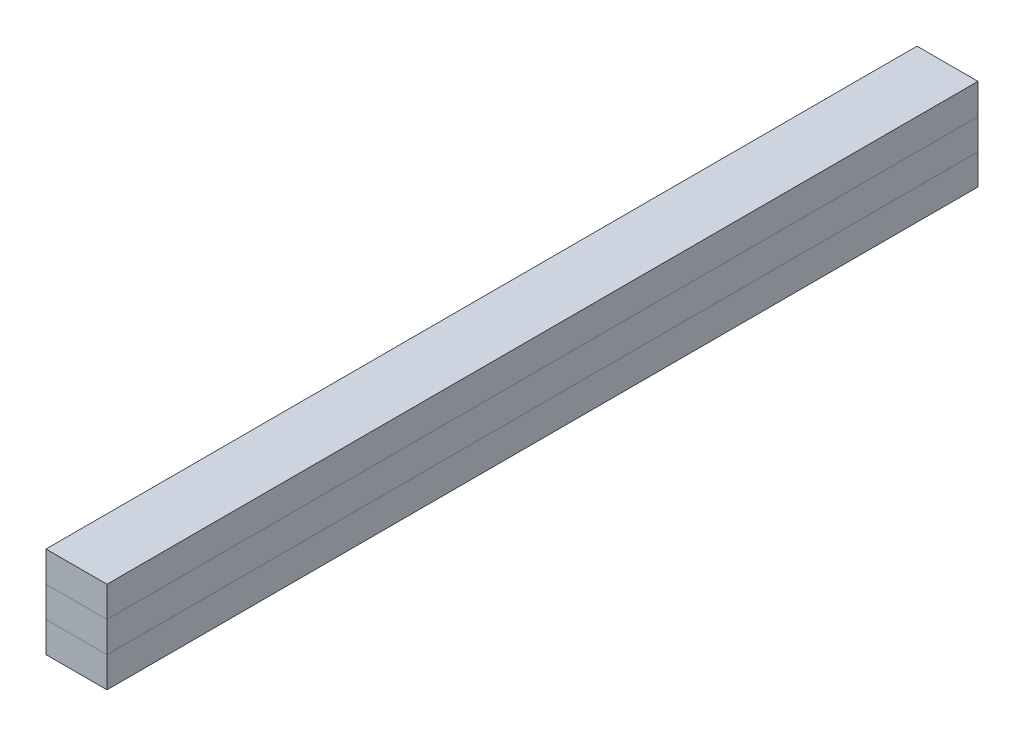
ISO-10303-21;
HEADER;
FILE_DESCRIPTION(('STEP AP214'),'2;1');
FILE_NAME('part.step','',(''),(''),'','','');
FILE_SCHEMA(('AUTOMOTIVE_DESIGN { 1 0 10303 214 1 1 1 1 }'));
ENDSEC;
DATA;
#1=APPLICATION_CONTEXT('core data for automotive mechanical design processes');
#2=APPLICATION_PROTOCOL_DEFINITION('international standard','automotive_design',2000,#1);
#3=PRODUCT_CONTEXT('',#1,'mechanical');
#4=PRODUCT('Part','Part','',(#3));
#5=PRODUCT_RELATED_PRODUCT_CATEGORY('part','',(#4));
#6=PRODUCT_DEFINITION_FORMATION('','',#4);
#7=PRODUCT_DEFINITION_CONTEXT('part definition',#1,'design');
#8=PRODUCT_DEFINITION('design','',#6,#7);
#9=PRODUCT_DEFINITION_SHAPE('','',#8);
#10=(LENGTH_UNIT() NAMED_UNIT(*) SI_UNIT(.MILLI.,.METRE.));
#11=(NAMED_UNIT(*) PLANE_ANGLE_UNIT() SI_UNIT($,.RADIAN.));
#12=(NAMED_UNIT(*) SI_UNIT($,.STERADIAN.) SOLID_ANGLE_UNIT());
#13=UNCERTAINTY_MEASURE_WITH_UNIT(LENGTH_MEASURE(1.E-05),#10,'distance_accuracy_value','');
#14=(GEOMETRIC_REPRESENTATION_CONTEXT(3) GLOBAL_UNCERTAINTY_ASSIGNED_CONTEXT((#13)) GLOBAL_UNIT_ASSIGNED_CONTEXT((#10,
#11,#12)) REPRESENTATION_CONTEXT('',''));
#15=CARTESIAN_POINT('',(0.,0.,0.));
#16=DIRECTION('',(0.,0.,1.));
#17=DIRECTION('',(1.,0.,0.));
#18=AXIS2_PLACEMENT_3D('',#15,#16,#17);
#19=CARTESIAN_POINT('',(0.,14.,-0.01));
#20=DIRECTION('',(0.,-1.,0.));
#21=DIRECTION('',(0.,0.,-1.));
#22=AXIS2_PLACEMENT_3D('',#19,#20,#21);
#23=PLANE('',#22);
#24=DIRECTION('',(0.,0.,1.));
#25=VECTOR('',#24,1.);
#26=CARTESIAN_POINT('',(0.,14.,-0.01));
#27=LINE('',#26,#25);
#28=CARTESIAN_POINT('',(0.,14.,0.));
#29=VERTEX_POINT('',#28);
#30=CARTESIAN_POINT('',(0.,14.,200.));
#31=VERTEX_POINT('',#30);
#32=EDGE_CURVE('E94',#29,#31,#27,.T.);
#33=ORIENTED_EDGE('',*,*,#32,.F.);
#34=DIRECTION('',(1.,0.,0.));
#35=VECTOR('',#34,1.);
#36=CARTESIAN_POINT('',(0.,14.,0.));
#37=LINE('',#36,#35);
#38=CARTESIAN_POINT('',(14.,14.,0.));
#39=VERTEX_POINT('',#38);
#40=EDGE_CURVE('E104',#29,#39,#37,.T.);
#41=ORIENTED_EDGE('',*,*,#40,.T.);
#42=DIRECTION('',(0.,0.,-1.));
#43=VECTOR('',#42,1.);
#44=CARTESIAN_POINT('',(14.,14.,-0.01));
#45=LINE('',#44,#43);
#46=CARTESIAN_POINT('',(14.,14.,200.));
#47=VERTEX_POINT('',#46);
#48=EDGE_CURVE('E105',#47,#39,#45,.T.);
#49=ORIENTED_EDGE('',*,*,#48,.F.);
#50=DIRECTION('',(1.,0.,0.));
#51=VECTOR('',#50,1.);
#52=CARTESIAN_POINT('',(0.,14.,200.));
#53=LINE('',#52,#51);
#54=EDGE_CURVE('E83',#31,#47,#53,.T.);
#55=ORIENTED_EDGE('',*,*,#54,.F.);
#56=EDGE_LOOP('',(#33,#41,#49,#55));
#57=FACE_BOUND('',#56,.T.);
#58=ADVANCED_FACE('F48',(#57),#23,.T.);
#59=CARTESIAN_POINT('',(0.,0.,200.));
#60=DIRECTION('',(-1.,0.,0.));
#61=DIRECTION('',(0.,0.,1.));
#62=AXIS2_PLACEMENT_3D('',#59,#60,#61);
#63=PLANE('',#62);
#64=DIRECTION('',(0.,1.,0.));
#65=VECTOR('',#64,1.);
#66=CARTESIAN_POINT('',(0.,0.,0.));
#67=LINE('',#66,#65);
#68=CARTESIAN_POINT('',(0.,21.,0.));
#69=VERTEX_POINT('',#68);
#70=EDGE_CURVE('E91',#29,#69,#67,.T.);
#71=ORIENTED_EDGE('',*,*,#70,.F.);
#72=ORIENTED_EDGE('',*,*,#32,.T.);
#73=DIRECTION('',(0.,1.,0.));
#74=VECTOR('',#73,1.);
#75=CARTESIAN_POINT('',(0.,0.,200.));
#76=LINE('',#75,#74);
#77=CARTESIAN_POINT('',(0.,21.,200.));
#78=VERTEX_POINT('',#77);
#79=EDGE_CURVE('E52',#31,#78,#76,.T.);
#80=ORIENTED_EDGE('',*,*,#79,.T.);
#81=DIRECTION('',(0.,0.,-1.));
#82=VECTOR('',#81,1.);
#83=CARTESIAN_POINT('',(0.,21.,200.));
#84=LINE('',#83,#82);
#85=EDGE_CURVE('E95',#78,#69,#84,.T.);
#86=ORIENTED_EDGE('',*,*,#85,.T.);
#87=EDGE_LOOP('',(#71,#72,#80,#86));
#88=FACE_BOUND('',#87,.T.);
#89=ADVANCED_FACE('F93',(#88),#63,.T.);
#90=CARTESIAN_POINT('',(0.,0.,0.));
#91=DIRECTION('',(0.,0.,1.));
#92=DIRECTION('',(1.,0.,0.));
#93=AXIS2_PLACEMENT_3D('',#90,#91,#92);
#94=PLANE('',#93);
#95=ORIENTED_EDGE('',*,*,#40,.F.);
#96=ORIENTED_EDGE('',*,*,#70,.T.);
#97=DIRECTION('',(1.,0.,0.));
#98=VECTOR('',#97,1.);
#99=CARTESIAN_POINT('',(0.,21.,0.));
#100=LINE('',#99,#98);
#101=CARTESIAN_POINT('',(14.,21.,0.));
#102=VERTEX_POINT('',#101);
#103=EDGE_CURVE('E58',#69,#102,#100,.T.);
#104=ORIENTED_EDGE('',*,*,#103,.T.);
#105=DIRECTION('',(0.,1.,0.));
#106=VECTOR('',#105,1.);
#107=CARTESIAN_POINT('',(14.,0.,0.));
#108=LINE('',#107,#106);
#109=EDGE_CURVE('E12',#39,#102,#108,.T.);
#110=ORIENTED_EDGE('',*,*,#109,.F.);
#111=EDGE_LOOP('',(#95,#96,#104,#110));
#112=FACE_BOUND('',#111,.T.);
#113=ADVANCED_FACE('F107',(#112),#94,.F.);
#114=CARTESIAN_POINT('',(14.,0.,200.));
#115=DIRECTION('',(-1.,0.,0.));
#116=DIRECTION('',(0.,0.,1.));
#117=AXIS2_PLACEMENT_3D('',#114,#115,#116);
#118=PLANE('',#117);
#119=DIRECTION('',(0.,1.,0.));
#120=VECTOR('',#119,1.);
#121=CARTESIAN_POINT('',(14.,0.,200.));
#122=LINE('',#121,#120);
#123=CARTESIAN_POINT('',(14.,21.,200.));
#124=VERTEX_POINT('',#123);
#125=EDGE_CURVE('E100',#47,#124,#122,.T.);
#126=ORIENTED_EDGE('',*,*,#125,.F.);
#127=ORIENTED_EDGE('',*,*,#48,.T.);
#128=ORIENTED_EDGE('',*,*,#109,.T.);
#129=DIRECTION('',(0.,0.,-1.));
#130=VECTOR('',#129,1.);
#131=CARTESIAN_POINT('',(14.,21.,200.));
#132=LINE('',#131,#130);
#133=EDGE_CURVE('E119',#124,#102,#132,.T.);
#134=ORIENTED_EDGE('',*,*,#133,.F.);
#135=EDGE_LOOP('',(#126,#127,#128,#134));
#136=FACE_BOUND('',#135,.T.);
#137=ADVANCED_FACE('F122',(#136),#118,.F.);
#138=CARTESIAN_POINT('',(0.,21.,200.));
#139=DIRECTION('',(0.,1.,0.));
#140=DIRECTION('',(0.,0.,1.));
#141=AXIS2_PLACEMENT_3D('',#138,#139,#140);
#142=PLANE('',#141);
#143=ORIENTED_EDGE('',*,*,#103,.F.);
#144=ORIENTED_EDGE('',*,*,#85,.F.);
#145=DIRECTION('',(1.,0.,0.));
#146=VECTOR('',#145,1.);
#147=CARTESIAN_POINT('',(0.,21.,200.));
#148=LINE('',#147,#146);
#149=EDGE_CURVE('E110',#78,#124,#148,.T.);
#150=ORIENTED_EDGE('',*,*,#149,.T.);
#151=ORIENTED_EDGE('',*,*,#133,.T.);
#152=EDGE_LOOP('',(#143,#144,#150,#151));
#153=FACE_BOUND('',#152,.T.);
#154=ADVANCED_FACE('F121',(#153),#142,.T.);
#155=CARTESIAN_POINT('',(0.,0.,200.));
#156=DIRECTION('',(0.,0.,1.));
#157=DIRECTION('',(1.,0.,0.));
#158=AXIS2_PLACEMENT_3D('',#155,#156,#157);
#159=PLANE('',#158);
#160=ORIENTED_EDGE('',*,*,#79,.F.);
#161=ORIENTED_EDGE('',*,*,#54,.T.);
#162=ORIENTED_EDGE('',*,*,#125,.T.);
#163=ORIENTED_EDGE('',*,*,#149,.F.);
#164=EDGE_LOOP('',(#160,#161,#162,#163));
#165=FACE_BOUND('',#164,.T.);
#166=ADVANCED_FACE('F50',(#165),#159,.T.);
#167=CLOSED_SHELL('',(#58,#89,#113,#137,#154,#166));
#168=MANIFOLD_SOLID_BREP('B2',#167);
#169=CARTESIAN_POINT('',(0.,7.,-0.01));
#170=DIRECTION('',(0.,-1.,0.));
#171=DIRECTION('',(0.,0.,-1.));
#172=AXIS2_PLACEMENT_3D('',#169,#170,#171);
#173=PLANE('',#172);
#174=DIRECTION('',(0.,0.,1.));
#175=VECTOR('',#174,1.);
#176=CARTESIAN_POINT('',(0.,7.,-0.01));
#177=LINE('',#176,#175);
#178=CARTESIAN_POINT('',(0.,7.,0.));
#179=VERTEX_POINT('',#178);
#180=CARTESIAN_POINT('',(0.,7.,200.));
#181=VERTEX_POINT('',#180);
#182=EDGE_CURVE('E242',#179,#181,#177,.T.);
#183=ORIENTED_EDGE('',*,*,#182,.T.);
#184=DIRECTION('',(1.,0.,0.));
#185=VECTOR('',#184,1.);
#186=CARTESIAN_POINT('',(0.,7.,200.));
#187=LINE('',#186,#185);
#188=CARTESIAN_POINT('',(14.,7.,200.));
#189=VERTEX_POINT('',#188);
#190=EDGE_CURVE('E244',#181,#189,#187,.T.);
#191=ORIENTED_EDGE('',*,*,#190,.T.);
#192=DIRECTION('',(0.,0.,-1.));
#193=VECTOR('',#192,1.);
#194=CARTESIAN_POINT('',(14.,7.,-0.01));
#195=LINE('',#194,#193);
#196=CARTESIAN_POINT('',(14.,7.,0.));
#197=VERTEX_POINT('',#196);
#198=EDGE_CURVE('E237',#189,#197,#195,.T.);
#199=ORIENTED_EDGE('',*,*,#198,.T.);
#200=DIRECTION('',(1.,0.,0.));
#201=VECTOR('',#200,1.);
#202=CARTESIAN_POINT('',(0.,7.,0.));
#203=LINE('',#202,#201);
#204=EDGE_CURVE('E227',#179,#197,#203,.T.);
#205=ORIENTED_EDGE('',*,*,#204,.F.);
#206=EDGE_LOOP('',(#183,#191,#199,#205));
#207=FACE_BOUND('',#206,.T.);
#208=ADVANCED_FACE('F191',(#207),#173,.F.);
#209=CARTESIAN_POINT('',(0.,0.,0.));
#210=DIRECTION('',(0.,0.,1.));
#211=DIRECTION('',(1.,0.,0.));
#212=AXIS2_PLACEMENT_3D('',#209,#210,#211);
#213=PLANE('',#212);
#214=DIRECTION('',(0.,1.,0.));
#215=VECTOR('',#214,1.);
#216=CARTESIAN_POINT('',(0.,0.,0.));
#217=LINE('',#216,#215);
#218=CARTESIAN_POINT('',(0.,0.,0.));
#219=VERTEX_POINT('',#218);
#220=EDGE_CURVE('E253',#219,#179,#217,.T.);
#221=ORIENTED_EDGE('',*,*,#220,.T.);
#222=ORIENTED_EDGE('',*,*,#204,.T.);
#223=DIRECTION('',(0.,1.,0.));
#224=VECTOR('',#223,1.);
#225=CARTESIAN_POINT('',(14.,0.,0.));
#226=LINE('',#225,#224);
#227=CARTESIAN_POINT('',(14.,0.,0.));
#228=VERTEX_POINT('',#227);
#229=EDGE_CURVE('E195',#228,#197,#226,.T.);
#230=ORIENTED_EDGE('',*,*,#229,.F.);
#231=DIRECTION('',(1.,0.,0.));
#232=VECTOR('',#231,1.);
#233=CARTESIAN_POINT('',(0.,0.,0.));
#234=LINE('',#233,#232);
#235=EDGE_CURVE('E46',#219,#228,#234,.T.);
#236=ORIENTED_EDGE('',*,*,#235,.F.);
#237=EDGE_LOOP('',(#221,#222,#230,#236));
#238=FACE_BOUND('',#237,.T.);
#239=ADVANCED_FACE('F257',(#238),#213,.F.);
#240=CARTESIAN_POINT('',(0.,0.,200.));
#241=DIRECTION('',(-1.,0.,0.));
#242=DIRECTION('',(0.,0.,1.));
#243=AXIS2_PLACEMENT_3D('',#240,#241,#242);
#244=PLANE('',#243);
#245=ORIENTED_EDGE('',*,*,#182,.F.);
#246=ORIENTED_EDGE('',*,*,#220,.F.);
#247=DIRECTION('',(0.,0.,-1.));
#248=VECTOR('',#247,1.);
#249=CARTESIAN_POINT('',(0.,0.,200.));
#250=LINE('',#249,#248);
#251=CARTESIAN_POINT('',(0.,0.,200.));
#252=VERTEX_POINT('',#251);
#253=EDGE_CURVE('E219',#252,#219,#250,.T.);
#254=ORIENTED_EDGE('',*,*,#253,.F.);
#255=DIRECTION('',(0.,1.,0.));
#256=VECTOR('',#255,1.);
#257=CARTESIAN_POINT('',(0.,0.,200.));
#258=LINE('',#257,#256);
#259=EDGE_CURVE('E251',#252,#181,#258,.T.);
#260=ORIENTED_EDGE('',*,*,#259,.T.);
#261=EDGE_LOOP('',(#245,#246,#254,#260));
#262=FACE_BOUND('',#261,.T.);
#263=ADVANCED_FACE('F258',(#262),#244,.T.);
#264=CARTESIAN_POINT('',(14.,0.,200.));
#265=DIRECTION('',(-1.,0.,0.));
#266=DIRECTION('',(0.,0.,1.));
#267=AXIS2_PLACEMENT_3D('',#264,#265,#266);
#268=PLANE('',#267);
#269=ORIENTED_EDGE('',*,*,#198,.F.);
#270=DIRECTION('',(0.,1.,0.));
#271=VECTOR('',#270,1.);
#272=CARTESIAN_POINT('',(14.,0.,200.));
#273=LINE('',#272,#271);
#274=CARTESIAN_POINT('',(14.,0.,200.));
#275=VERTEX_POINT('',#274);
#276=EDGE_CURVE('E240',#275,#189,#273,.T.);
#277=ORIENTED_EDGE('',*,*,#276,.F.);
#278=DIRECTION('',(0.,0.,-1.));
#279=VECTOR('',#278,1.);
#280=CARTESIAN_POINT('',(14.,0.,200.));
#281=LINE('',#280,#279);
#282=EDGE_CURVE('E261',#275,#228,#281,.T.);
#283=ORIENTED_EDGE('',*,*,#282,.T.);
#284=ORIENTED_EDGE('',*,*,#229,.T.);
#285=EDGE_LOOP('',(#269,#277,#283,#284));
#286=FACE_BOUND('',#285,.T.);
#287=ADVANCED_FACE('F193',(#286),#268,.F.);
#288=CARTESIAN_POINT('',(0.,0.,200.));
#289=DIRECTION('',(0.,1.,0.));
#290=DIRECTION('',(0.,0.,1.));
#291=AXIS2_PLACEMENT_3D('',#288,#289,#290);
#292=PLANE('',#291);
#293=ORIENTED_EDGE('',*,*,#235,.T.);
#294=ORIENTED_EDGE('',*,*,#282,.F.);
#295=DIRECTION('',(1.,0.,0.));
#296=VECTOR('',#295,1.);
#297=CARTESIAN_POINT('',(0.,0.,200.));
#298=LINE('',#297,#296);
#299=EDGE_CURVE('E249',#252,#275,#298,.T.);
#300=ORIENTED_EDGE('',*,*,#299,.F.);
#301=ORIENTED_EDGE('',*,*,#253,.T.);
#302=EDGE_LOOP('',(#293,#294,#300,#301));
#303=FACE_BOUND('',#302,.T.);
#304=ADVANCED_FACE('F265',(#303),#292,.F.);
#305=CARTESIAN_POINT('',(0.,0.,200.));
#306=DIRECTION('',(0.,0.,1.));
#307=DIRECTION('',(1.,0.,0.));
#308=AXIS2_PLACEMENT_3D('',#305,#306,#307);
#309=PLANE('',#308);
#310=ORIENTED_EDGE('',*,*,#190,.F.);
#311=ORIENTED_EDGE('',*,*,#259,.F.);
#312=ORIENTED_EDGE('',*,*,#299,.T.);
#313=ORIENTED_EDGE('',*,*,#276,.T.);
#314=EDGE_LOOP('',(#310,#311,#312,#313));
#315=FACE_BOUND('',#314,.T.);
#316=ADVANCED_FACE('F248',(#315),#309,.T.);
#317=CLOSED_SHELL('',(#208,#239,#263,#287,#304,#316));
#318=MANIFOLD_SOLID_BREP('B6',#317);
#319=CARTESIAN_POINT('',(0.,14.,-0.01));
#320=DIRECTION('',(0.,-1.,0.));
#321=DIRECTION('',(0.,0.,-1.));
#322=AXIS2_PLACEMENT_3D('',#319,#320,#321);
#323=PLANE('',#322);
#324=DIRECTION('',(0.,0.,1.));
#325=VECTOR('',#324,1.);
#326=CARTESIAN_POINT('',(0.,14.,-0.01));
#327=LINE('',#326,#325);
#328=CARTESIAN_POINT('',(0.,14.,0.));
#329=VERTEX_POINT('',#328);
#330=CARTESIAN_POINT('',(0.,14.,200.));
#331=VERTEX_POINT('',#330);
#332=EDGE_CURVE('E329',#329,#331,#327,.T.);
#333=ORIENTED_EDGE('',*,*,#332,.T.);
#334=DIRECTION('',(1.,0.,0.));
#335=VECTOR('',#334,1.);
#336=CARTESIAN_POINT('',(0.,14.,200.));
#337=LINE('',#336,#335);
#338=CARTESIAN_POINT('',(14.,14.,200.));
#339=VERTEX_POINT('',#338);
#340=EDGE_CURVE('E334',#331,#339,#337,.T.);
#341=ORIENTED_EDGE('',*,*,#340,.T.);
#342=DIRECTION('',(0.,0.,-1.));
#343=VECTOR('',#342,1.);
#344=CARTESIAN_POINT('',(14.,14.,-0.01));
#345=LINE('',#344,#343);
#346=CARTESIAN_POINT('',(14.,14.,0.));
#347=VERTEX_POINT('',#346);
#348=EDGE_CURVE('E374',#339,#347,#345,.T.);
#349=ORIENTED_EDGE('',*,*,#348,.T.);
#350=DIRECTION('',(1.,0.,0.));
#351=VECTOR('',#350,1.);
#352=CARTESIAN_POINT('',(0.,14.,0.));
#353=LINE('',#352,#351);
#354=EDGE_CURVE('E371',#329,#347,#353,.T.);
#355=ORIENTED_EDGE('',*,*,#354,.F.);
#356=EDGE_LOOP('',(#333,#341,#349,#355));
#357=FACE_BOUND('',#356,.T.);
#358=ADVANCED_FACE('F325',(#357),#323,.F.);
#359=CARTESIAN_POINT('',(0.,7.,-0.01));
#360=DIRECTION('',(0.,-1.,0.));
#361=DIRECTION('',(0.,0.,-1.));
#362=AXIS2_PLACEMENT_3D('',#359,#360,#361);
#363=PLANE('',#362);
#364=DIRECTION('',(0.,0.,1.));
#365=VECTOR('',#364,1.);
#366=CARTESIAN_POINT('',(0.,7.,-0.01));
#367=LINE('',#366,#365);
#368=CARTESIAN_POINT('',(0.,7.,0.));
#369=VERTEX_POINT('',#368);
#370=CARTESIAN_POINT('',(0.,7.,200.));
#371=VERTEX_POINT('',#370);
#372=EDGE_CURVE('E390',#369,#371,#367,.T.);
#373=ORIENTED_EDGE('',*,*,#372,.F.);
#374=DIRECTION('',(1.,0.,0.));
#375=VECTOR('',#374,1.);
#376=CARTESIAN_POINT('',(0.,7.,0.));
#377=LINE('',#376,#375);
#378=CARTESIAN_POINT('',(14.,7.,0.));
#379=VERTEX_POINT('',#378);
#380=EDGE_CURVE('E189',#369,#379,#377,.T.);
#381=ORIENTED_EDGE('',*,*,#380,.T.);
#382=DIRECTION('',(0.,0.,-1.));
#383=VECTOR('',#382,1.);
#384=CARTESIAN_POINT('',(14.,7.,-0.01));
#385=LINE('',#384,#383);
#386=CARTESIAN_POINT('',(14.,7.,200.));
#387=VERTEX_POINT('',#386);
#388=EDGE_CURVE('E391',#387,#379,#385,.T.);
#389=ORIENTED_EDGE('',*,*,#388,.F.);
#390=DIRECTION('',(1.,0.,0.));
#391=VECTOR('',#390,1.);
#392=CARTESIAN_POINT('',(0.,7.,200.));
#393=LINE('',#392,#391);
#394=EDGE_CURVE('E375',#371,#387,#393,.T.);
#395=ORIENTED_EDGE('',*,*,#394,.F.);
#396=EDGE_LOOP('',(#373,#381,#389,#395));
#397=FACE_BOUND('',#396,.T.);
#398=ADVANCED_FACE('F327',(#397),#363,.T.);
#399=CARTESIAN_POINT('',(0.,0.,200.));
#400=DIRECTION('',(-1.,0.,0.));
#401=DIRECTION('',(0.,0.,1.));
#402=AXIS2_PLACEMENT_3D('',#399,#400,#401);
#403=PLANE('',#402);
#404=ORIENTED_EDGE('',*,*,#332,.F.);
#405=DIRECTION('',(0.,1.,0.));
#406=VECTOR('',#405,1.);
#407=CARTESIAN_POINT('',(0.,0.,0.));
#408=LINE('',#407,#406);
#409=EDGE_CURVE('E342',#369,#329,#408,.T.);
#410=ORIENTED_EDGE('',*,*,#409,.F.);
#411=ORIENTED_EDGE('',*,*,#372,.T.);
#412=DIRECTION('',(0.,1.,0.));
#413=VECTOR('',#412,1.);
#414=CARTESIAN_POINT('',(0.,0.,200.));
#415=LINE('',#414,#413);
#416=EDGE_CURVE('E376',#371,#331,#415,.T.);
#417=ORIENTED_EDGE('',*,*,#416,.T.);
#418=EDGE_LOOP('',(#404,#410,#411,#417));
#419=FACE_BOUND('',#418,.T.);
#420=ADVANCED_FACE('F378',(#419),#403,.T.);
#421=CARTESIAN_POINT('',(0.,0.,0.));
#422=DIRECTION('',(0.,0.,1.));
#423=DIRECTION('',(1.,0.,0.));
#424=AXIS2_PLACEMENT_3D('',#421,#422,#423);
#425=PLANE('',#424);
#426=ORIENTED_EDGE('',*,*,#380,.F.);
#427=ORIENTED_EDGE('',*,*,#409,.T.);
#428=ORIENTED_EDGE('',*,*,#354,.T.);
#429=DIRECTION('',(0.,1.,0.));
#430=VECTOR('',#429,1.);
#431=CARTESIAN_POINT('',(14.,0.,0.));
#432=LINE('',#431,#430);
#433=EDGE_CURVE('E350',#379,#347,#432,.T.);
#434=ORIENTED_EDGE('',*,*,#433,.F.);
#435=EDGE_LOOP('',(#426,#427,#428,#434));
#436=FACE_BOUND('',#435,.T.);
#437=ADVANCED_FACE('F380',(#436),#425,.F.);
#438=CARTESIAN_POINT('',(14.,0.,200.));
#439=DIRECTION('',(-1.,0.,0.));
#440=DIRECTION('',(0.,0.,1.));
#441=AXIS2_PLACEMENT_3D('',#438,#439,#440);
#442=PLANE('',#441);
#443=DIRECTION('',(0.,1.,0.));
#444=VECTOR('',#443,1.);
#445=CARTESIAN_POINT('',(14.,0.,200.));
#446=LINE('',#445,#444);
#447=EDGE_CURVE('E381',#387,#339,#446,.T.);
#448=ORIENTED_EDGE('',*,*,#447,.F.);
#449=ORIENTED_EDGE('',*,*,#388,.T.);
#450=ORIENTED_EDGE('',*,*,#433,.T.);
#451=ORIENTED_EDGE('',*,*,#348,.F.);
#452=EDGE_LOOP('',(#448,#449,#450,#451));
#453=FACE_BOUND('',#452,.T.);
#454=ADVANCED_FACE('F399',(#453),#442,.F.);
#455=CARTESIAN_POINT('',(0.,0.,200.));
#456=DIRECTION('',(0.,0.,1.));
#457=DIRECTION('',(1.,0.,0.));
#458=AXIS2_PLACEMENT_3D('',#455,#456,#457);
#459=PLANE('',#458);
#460=ORIENTED_EDGE('',*,*,#416,.F.);
#461=ORIENTED_EDGE('',*,*,#394,.T.);
#462=ORIENTED_EDGE('',*,*,#447,.T.);
#463=ORIENTED_EDGE('',*,*,#340,.F.);
#464=EDGE_LOOP('',(#460,#461,#462,#463));
#465=FACE_BOUND('',#464,.T.);
#466=ADVANCED_FACE('F395',(#465),#459,.T.);
#467=CLOSED_SHELL('',(#358,#398,#420,#437,#454,#466));
#468=MANIFOLD_SOLID_BREP('B40',#467);
#469=ADVANCED_BREP_SHAPE_REPRESENTATION('',(#18,#168,#318,#468),#14);
#470=SHAPE_DEFINITION_REPRESENTATION(#9,#469);
ENDSEC;
END-ISO-10303-21;
